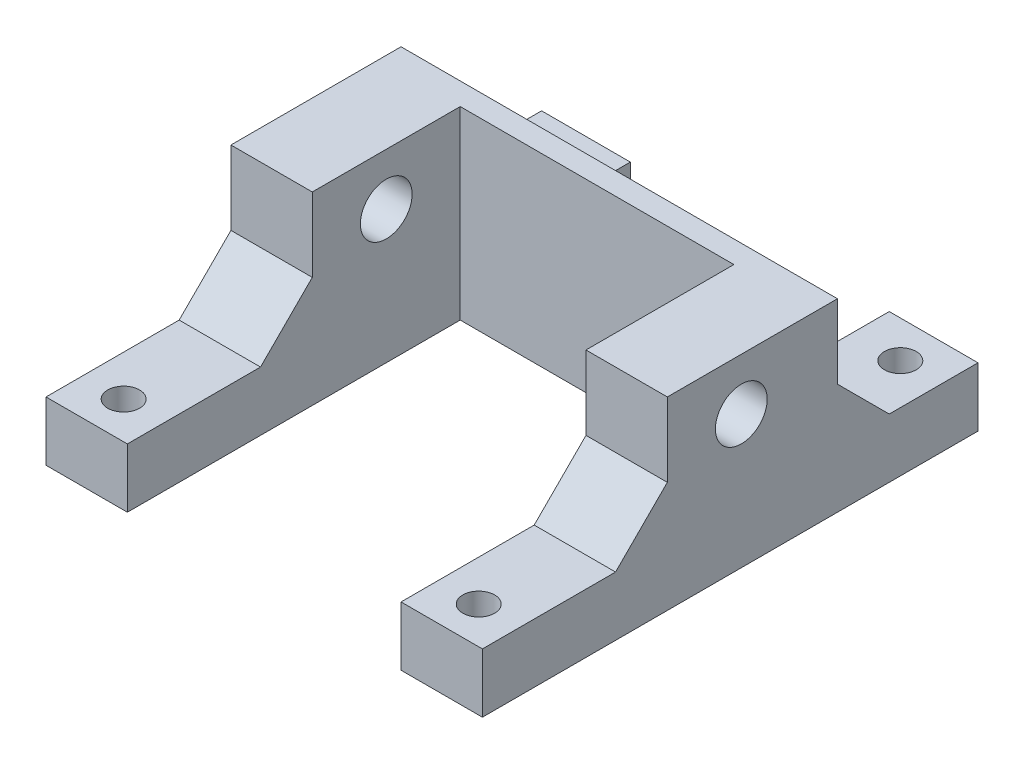
ISO-10303-21;
HEADER;
FILE_DESCRIPTION(('STEP AP214'),'2;1');
FILE_NAME('part.step','',(''),(''),'','','');
FILE_SCHEMA(('AUTOMOTIVE_DESIGN { 1 0 10303 214 1 1 1 1 }'));
ENDSEC;
DATA;
#1=APPLICATION_CONTEXT('core data for automotive mechanical design processes');
#2=APPLICATION_PROTOCOL_DEFINITION('international standard','automotive_design',2000,#1);
#3=PRODUCT_CONTEXT('',#1,'mechanical');
#4=PRODUCT('Part','Part','',(#3));
#5=PRODUCT_RELATED_PRODUCT_CATEGORY('part','',(#4));
#6=PRODUCT_DEFINITION_FORMATION('','',#4);
#7=PRODUCT_DEFINITION_CONTEXT('part definition',#1,'design');
#8=PRODUCT_DEFINITION('design','',#6,#7);
#9=PRODUCT_DEFINITION_SHAPE('','',#8);
#10=(LENGTH_UNIT() NAMED_UNIT(*) SI_UNIT(.MILLI.,.METRE.));
#11=(NAMED_UNIT(*) PLANE_ANGLE_UNIT() SI_UNIT($,.RADIAN.));
#12=(NAMED_UNIT(*) SI_UNIT($,.STERADIAN.) SOLID_ANGLE_UNIT());
#13=UNCERTAINTY_MEASURE_WITH_UNIT(LENGTH_MEASURE(1.E-05),#10,'distance_accuracy_value','');
#14=(GEOMETRIC_REPRESENTATION_CONTEXT(3) GLOBAL_UNCERTAINTY_ASSIGNED_CONTEXT((#13)) GLOBAL_UNIT_ASSIGNED_CONTEXT((#10,
#11,#12)) REPRESENTATION_CONTEXT('',''));
#15=CARTESIAN_POINT('',(0.,0.,0.));
#16=DIRECTION('',(0.,0.,1.));
#17=DIRECTION('',(1.,0.,0.));
#18=AXIS2_PLACEMENT_3D('',#15,#16,#17);
#19=CARTESIAN_POINT('',(29.5,8.00000000000001,0.));
#20=DIRECTION('',(0.,-1.,0.));
#21=DIRECTION('',(0.,0.,1.));
#22=AXIS2_PLACEMENT_3D('',#19,#20,#21);
#23=PLANE('',#22);
#24=CARTESIAN_POINT('',(24.,8.00000000000001,-14.));
#25=DIRECTION('',(0.,1.,0.));
#26=DIRECTION('',(0.,0.,1.));
#27=AXIS2_PLACEMENT_3D('',#24,#25,#26);
#28=CIRCLE('',#27,2.14999999999999);
#29=CARTESIAN_POINT('',(24.,8.00000000000001,-11.85));
#30=VERTEX_POINT('',#29);
#31=EDGE_CURVE('E558',#30,#30,#28,.T.);
#32=ORIENTED_EDGE('',*,*,#31,.F.);
#33=EDGE_LOOP('',(#32));
#34=FACE_BOUND('',#33,.T.);
#35=DIRECTION('',(0.,0.,-1.));
#36=VECTOR('',#35,1.);
#37=CARTESIAN_POINT('',(29.5,8.00000000000001,0.));
#38=LINE('',#37,#36);
#39=CARTESIAN_POINT('',(29.5,8.00000000000001,-7.00000000000012));
#40=VERTEX_POINT('',#39);
#41=CARTESIAN_POINT('',(29.5,8.00000000000001,-19.));
#42=VERTEX_POINT('',#41);
#43=EDGE_CURVE('E315',#40,#42,#38,.T.);
#44=ORIENTED_EDGE('',*,*,#43,.T.);
#45=DIRECTION('',(-1.,0.,0.));
#46=VECTOR('',#45,1.);
#47=CARTESIAN_POINT('',(29.5,8.00000000000001,-19.));
#48=LINE('',#47,#46);
#49=CARTESIAN_POINT('',(17.5,8.00000000000001,-19.));
#50=VERTEX_POINT('',#49);
#51=EDGE_CURVE('E378',#42,#50,#48,.T.);
#52=ORIENTED_EDGE('',*,*,#51,.T.);
#53=DIRECTION('',(0.,0.,1.));
#54=VECTOR('',#53,1.);
#55=CARTESIAN_POINT('',(17.5,8.00000000000001,-5.));
#56=LINE('',#55,#54);
#57=CARTESIAN_POINT('',(17.5,8.00000000000001,-7.00000000000012));
#58=VERTEX_POINT('',#57);
#59=EDGE_CURVE('E234',#50,#58,#56,.T.);
#60=ORIENTED_EDGE('',*,*,#59,.T.);
#61=DIRECTION('',(-1.,0.,0.));
#62=VECTOR('',#61,1.);
#63=CARTESIAN_POINT('',(-29.5,8.00000000000001,-7.00000000000012));
#64=LINE('',#63,#62);
#65=EDGE_CURVE('E409',#40,#58,#64,.T.);
#66=ORIENTED_EDGE('',*,*,#65,.F.);
#67=EDGE_LOOP('',(#44,#52,#60,#66));
#68=FACE_BOUND('',#67,.T.);
#69=ADVANCED_FACE('F47',(#34,#68),#23,.F.);
#70=CARTESIAN_POINT('',(29.5,0.,48.));
#71=DIRECTION('',(0.,1.,0.));
#72=DIRECTION('',(0.,0.,-1.));
#73=AXIS2_PLACEMENT_3D('',#70,#71,#72);
#74=PLANE('',#73);
#75=CARTESIAN_POINT('',(-24.,0.,43.));
#76=DIRECTION('',(0.,1.,0.));
#77=DIRECTION('',(0.,0.,1.));
#78=AXIS2_PLACEMENT_3D('',#75,#76,#77);
#79=CIRCLE('',#78,2.14999999999999);
#80=CARTESIAN_POINT('',(-24.,0.,45.15));
#81=VERTEX_POINT('',#80);
#82=EDGE_CURVE('E544',#81,#81,#79,.T.);
#83=ORIENTED_EDGE('',*,*,#82,.T.);
#84=EDGE_LOOP('',(#83));
#85=FACE_BOUND('',#84,.T.);
#86=CARTESIAN_POINT('',(24.,0.,-14.));
#87=DIRECTION('',(0.,1.,0.));
#88=DIRECTION('',(0.,0.,1.));
#89=AXIS2_PLACEMENT_3D('',#86,#87,#88);
#90=CIRCLE('',#89,2.14999999999999);
#91=CARTESIAN_POINT('',(24.,0.,-11.85));
#92=VERTEX_POINT('',#91);
#93=EDGE_CURVE('E555',#92,#92,#90,.T.);
#94=ORIENTED_EDGE('',*,*,#93,.T.);
#95=EDGE_LOOP('',(#94));
#96=FACE_BOUND('',#95,.T.);
#97=CARTESIAN_POINT('',(24.,0.,43.));
#98=DIRECTION('',(0.,1.,0.));
#99=DIRECTION('',(0.,0.,1.));
#100=AXIS2_PLACEMENT_3D('',#97,#98,#99);
#101=CIRCLE('',#100,2.14999999999999);
#102=CARTESIAN_POINT('',(24.,0.,45.15));
#103=VERTEX_POINT('',#102);
#104=EDGE_CURVE('E562',#103,#103,#101,.T.);
#105=ORIENTED_EDGE('',*,*,#104,.T.);
#106=EDGE_LOOP('',(#105));
#107=FACE_BOUND('',#106,.T.);
#108=DIRECTION('',(-1.,0.,0.));
#109=VECTOR('',#108,1.);
#110=CARTESIAN_POINT('',(29.5,0.,-19.));
#111=LINE('',#110,#109);
#112=CARTESIAN_POINT('',(29.5,0.,-19.));
#113=VERTEX_POINT('',#112);
#114=CARTESIAN_POINT('',(17.5,0.,-19.));
#115=VERTEX_POINT('',#114);
#116=EDGE_CURVE('E375',#113,#115,#111,.T.);
#117=ORIENTED_EDGE('',*,*,#116,.F.);
#118=DIRECTION('',(0.,0.,1.));
#119=VECTOR('',#118,1.);
#120=CARTESIAN_POINT('',(29.5,0.,48.));
#121=LINE('',#120,#119);
#122=CARTESIAN_POINT('',(29.5,0.,48.));
#123=VERTEX_POINT('',#122);
#124=EDGE_CURVE('E321',#113,#123,#121,.T.);
#125=ORIENTED_EDGE('',*,*,#124,.T.);
#126=DIRECTION('',(-1.,0.,0.));
#127=VECTOR('',#126,1.);
#128=CARTESIAN_POINT('',(29.5,0.,48.));
#129=LINE('',#128,#127);
#130=CARTESIAN_POINT('',(18.5,0.,48.));
#131=VERTEX_POINT('',#130);
#132=EDGE_CURVE('E371',#123,#131,#129,.T.);
#133=ORIENTED_EDGE('',*,*,#132,.T.);
#134=DIRECTION('',(0.,0.,-1.));
#135=VECTOR('',#134,1.);
#136=CARTESIAN_POINT('',(18.5,0.,3.));
#137=LINE('',#136,#135);
#138=CARTESIAN_POINT('',(18.5,0.,3.));
#139=VERTEX_POINT('',#138);
#140=EDGE_CURVE('E254',#131,#139,#137,.T.);
#141=ORIENTED_EDGE('',*,*,#140,.T.);
#142=DIRECTION('',(-1.,0.,0.));
#143=VECTOR('',#142,1.);
#144=CARTESIAN_POINT('',(-18.5,0.,3.));
#145=LINE('',#144,#143);
#146=CARTESIAN_POINT('',(-18.5,0.,3.));
#147=VERTEX_POINT('',#146);
#148=EDGE_CURVE('E244',#139,#147,#145,.T.);
#149=ORIENTED_EDGE('',*,*,#148,.T.);
#150=DIRECTION('',(0.,0.,1.));
#151=VECTOR('',#150,1.);
#152=CARTESIAN_POINT('',(-18.5,0.,3.));
#153=LINE('',#152,#151);
#154=CARTESIAN_POINT('',(-18.5,0.,48.));
#155=VERTEX_POINT('',#154);
#156=EDGE_CURVE('E241',#147,#155,#153,.T.);
#157=ORIENTED_EDGE('',*,*,#156,.T.);
#158=CARTESIAN_POINT('',(-29.5,0.,48.));
#159=VERTEX_POINT('',#158);
#160=EDGE_CURVE('E370',#155,#159,#129,.T.);
#161=ORIENTED_EDGE('',*,*,#160,.T.);
#162=DIRECTION('',(0.,0.,1.));
#163=VECTOR('',#162,1.);
#164=CARTESIAN_POINT('',(-29.5,0.,48.));
#165=LINE('',#164,#163);
#166=CARTESIAN_POINT('',(-29.5,0.,-19.));
#167=VERTEX_POINT('',#166);
#168=EDGE_CURVE('E350',#167,#159,#165,.T.);
#169=ORIENTED_EDGE('',*,*,#168,.F.);
#170=CARTESIAN_POINT('',(-17.5,0.,-19.));
#171=VERTEX_POINT('',#170);
#172=EDGE_CURVE('E374',#171,#167,#111,.T.);
#173=ORIENTED_EDGE('',*,*,#172,.F.);
#174=DIRECTION('',(0.,0.,1.));
#175=VECTOR('',#174,1.);
#176=CARTESIAN_POINT('',(-17.5,0.,-5.));
#177=LINE('',#176,#175);
#178=CARTESIAN_POINT('',(-17.5,0.,-5.));
#179=VERTEX_POINT('',#178);
#180=EDGE_CURVE('E235',#171,#179,#177,.T.);
#181=ORIENTED_EDGE('',*,*,#180,.T.);
#182=DIRECTION('',(1.,0.,0.));
#183=VECTOR('',#182,1.);
#184=CARTESIAN_POINT('',(-17.5,0.,-5.));
#185=LINE('',#184,#183);
#186=CARTESIAN_POINT('',(17.5,0.,-5.));
#187=VERTEX_POINT('',#186);
#188=EDGE_CURVE('E219',#179,#187,#185,.T.);
#189=ORIENTED_EDGE('',*,*,#188,.T.);
#190=DIRECTION('',(0.,0.,-1.));
#191=VECTOR('',#190,1.);
#192=CARTESIAN_POINT('',(17.5,0.,-5.));
#193=LINE('',#192,#191);
#194=EDGE_CURVE('E227',#187,#115,#193,.T.);
#195=ORIENTED_EDGE('',*,*,#194,.T.);
#196=EDGE_LOOP('',(#117,#125,#133,#141,#149,#157,#161,#169,#173,#181,#189,#195));
#197=FACE_BOUND('',#196,.T.);
#198=CARTESIAN_POINT('',(-24.,0.,-14.));
#199=DIRECTION('',(0.,1.,0.));
#200=DIRECTION('',(0.,0.,1.));
#201=AXIS2_PLACEMENT_3D('',#198,#199,#200);
#202=CIRCLE('',#201,2.14999999999999);
#203=CARTESIAN_POINT('',(-24.,0.,-11.85));
#204=VERTEX_POINT('',#203);
#205=EDGE_CURVE('E545',#204,#204,#202,.T.);
#206=ORIENTED_EDGE('',*,*,#205,.T.);
#207=EDGE_LOOP('',(#206));
#208=FACE_BOUND('',#207,.T.);
#209=ADVANCED_FACE('F237',(#85,#96,#107,#197,#208),#74,.F.);
#210=CARTESIAN_POINT('',(29.5,8.00000000000001,-19.));
#211=DIRECTION('',(0.,0.,1.));
#212=DIRECTION('',(-1.,0.,0.));
#213=AXIS2_PLACEMENT_3D('',#210,#211,#212);
#214=PLANE('',#213);
#215=ORIENTED_EDGE('',*,*,#51,.F.);
#216=DIRECTION('',(0.,-1.,0.));
#217=VECTOR('',#216,1.);
#218=CARTESIAN_POINT('',(29.5,8.00000000000001,-19.));
#219=LINE('',#218,#217);
#220=EDGE_CURVE('E319',#42,#113,#219,.T.);
#221=ORIENTED_EDGE('',*,*,#220,.T.);
#222=ORIENTED_EDGE('',*,*,#116,.T.);
#223=DIRECTION('',(0.,1.,0.));
#224=VECTOR('',#223,1.);
#225=CARTESIAN_POINT('',(17.5,-0.00100000000001488,-19.));
#226=LINE('',#225,#224);
#227=EDGE_CURVE('E230',#115,#50,#226,.T.);
#228=ORIENTED_EDGE('',*,*,#227,.T.);
#229=EDGE_LOOP('',(#215,#221,#222,#228));
#230=FACE_BOUND('',#229,.T.);
#231=ADVANCED_FACE('F517',(#230),#214,.F.);
#232=CARTESIAN_POINT('',(29.5,8.00000000000001,48.));
#233=DIRECTION('',(0.,0.,-1.));
#234=DIRECTION('',(1.,0.,0.));
#235=AXIS2_PLACEMENT_3D('',#232,#233,#234);
#236=PLANE('',#235);
#237=ORIENTED_EDGE('',*,*,#132,.F.);
#238=DIRECTION('',(0.,1.,0.));
#239=VECTOR('',#238,1.);
#240=CARTESIAN_POINT('',(29.5,8.00000000000001,48.));
#241=LINE('',#240,#239);
#242=CARTESIAN_POINT('',(29.5,8.00000000000001,48.));
#243=VERTEX_POINT('',#242);
#244=EDGE_CURVE('E325',#123,#243,#241,.T.);
#245=ORIENTED_EDGE('',*,*,#244,.T.);
#246=DIRECTION('',(-1.,0.,0.));
#247=VECTOR('',#246,1.);
#248=CARTESIAN_POINT('',(29.5,8.00000000000001,48.));
#249=LINE('',#248,#247);
#250=CARTESIAN_POINT('',(18.5,8.00000000000001,48.));
#251=VERTEX_POINT('',#250);
#252=EDGE_CURVE('E367',#243,#251,#249,.T.);
#253=ORIENTED_EDGE('',*,*,#252,.T.);
#254=DIRECTION('',(0.,1.,0.));
#255=VECTOR('',#254,1.);
#256=CARTESIAN_POINT('',(18.5,-0.00100000000000794,48.));
#257=LINE('',#256,#255);
#258=EDGE_CURVE('E264',#131,#251,#257,.T.);
#259=ORIENTED_EDGE('',*,*,#258,.F.);
#260=EDGE_LOOP('',(#237,#245,#253,#259));
#261=FACE_BOUND('',#260,.T.);
#262=ADVANCED_FACE('F514',(#261),#236,.F.);
#263=CARTESIAN_POINT('',(29.5,8.00000000000001,23.));
#264=DIRECTION('',(0.,-1.,0.));
#265=DIRECTION('',(0.,0.,1.));
#266=AXIS2_PLACEMENT_3D('',#263,#264,#265);
#267=PLANE('',#266);
#268=CARTESIAN_POINT('',(24.,8.00000000000001,43.));
#269=DIRECTION('',(0.,1.,0.));
#270=DIRECTION('',(0.,0.,1.));
#271=AXIS2_PLACEMENT_3D('',#268,#269,#270);
#272=CIRCLE('',#271,2.14999999999999);
#273=CARTESIAN_POINT('',(24.,8.00000000000001,45.15));
#274=VERTEX_POINT('',#273);
#275=EDGE_CURVE('E566',#274,#274,#272,.T.);
#276=ORIENTED_EDGE('',*,*,#275,.F.);
#277=EDGE_LOOP('',(#276));
#278=FACE_BOUND('',#277,.T.);
#279=DIRECTION('',(0.,0.,1.));
#280=VECTOR('',#279,1.);
#281=CARTESIAN_POINT('',(18.5,8.00000000000001,3.));
#282=LINE('',#281,#280);
#283=CARTESIAN_POINT('',(18.5,8.00000000000001,30.));
#284=VERTEX_POINT('',#283);
#285=EDGE_CURVE('E258',#284,#251,#282,.T.);
#286=ORIENTED_EDGE('',*,*,#285,.T.);
#287=ORIENTED_EDGE('',*,*,#252,.F.);
#288=DIRECTION('',(0.,0.,-1.));
#289=VECTOR('',#288,1.);
#290=CARTESIAN_POINT('',(29.5,8.00000000000001,23.));
#291=LINE('',#290,#289);
#292=CARTESIAN_POINT('',(29.5,8.00000000000001,30.));
#293=VERTEX_POINT('',#292);
#294=EDGE_CURVE('E328',#243,#293,#291,.T.);
#295=ORIENTED_EDGE('',*,*,#294,.T.);
#296=DIRECTION('',(1.,0.,0.));
#297=VECTOR('',#296,1.);
#298=CARTESIAN_POINT('',(29.5,8.00000000000001,30.));
#299=LINE('',#298,#297);
#300=EDGE_CURVE('E395',#284,#293,#299,.T.);
#301=ORIENTED_EDGE('',*,*,#300,.F.);
#302=EDGE_LOOP('',(#286,#287,#295,#301));
#303=FACE_BOUND('',#302,.T.);
#304=ADVANCED_FACE('F510',(#278,#303),#267,.F.);
#305=CARTESIAN_POINT('',(29.5,25.,23.));
#306=DIRECTION('',(0.,0.,-1.));
#307=DIRECTION('',(1.,0.,0.));
#308=AXIS2_PLACEMENT_3D('',#305,#306,#307);
#309=PLANE('',#308);
#310=DIRECTION('',(0.,1.,0.));
#311=VECTOR('',#310,1.);
#312=CARTESIAN_POINT('',(-18.5,8.00000000000001,23.));
#313=LINE('',#312,#311);
#314=CARTESIAN_POINT('',(-18.5,15.,23.));
#315=VERTEX_POINT('',#314);
#316=CARTESIAN_POINT('',(-18.5,25.,23.));
#317=VERTEX_POINT('',#316);
#318=EDGE_CURVE('E268',#315,#317,#313,.T.);
#319=ORIENTED_EDGE('',*,*,#318,.T.);
#320=DIRECTION('',(-1.,0.,0.));
#321=VECTOR('',#320,1.);
#322=CARTESIAN_POINT('',(29.5,25.,23.));
#323=LINE('',#322,#321);
#324=CARTESIAN_POINT('',(-29.5,25.,23.));
#325=VERTEX_POINT('',#324);
#326=EDGE_CURVE('E336',#317,#325,#323,.T.);
#327=ORIENTED_EDGE('',*,*,#326,.T.);
#328=DIRECTION('',(0.,1.,0.));
#329=VECTOR('',#328,1.);
#330=CARTESIAN_POINT('',(-29.5,25.,23.));
#331=LINE('',#330,#329);
#332=CARTESIAN_POINT('',(-29.5,15.,23.));
#333=VERTEX_POINT('',#332);
#334=EDGE_CURVE('E311',#333,#325,#331,.T.);
#335=ORIENTED_EDGE('',*,*,#334,.F.);
#336=DIRECTION('',(-1.,0.,0.));
#337=VECTOR('',#336,1.);
#338=CARTESIAN_POINT('',(-29.5,15.,23.));
#339=LINE('',#338,#337);
#340=EDGE_CURVE('E399',#315,#333,#339,.T.);
#341=ORIENTED_EDGE('',*,*,#340,.F.);
#342=EDGE_LOOP('',(#319,#327,#335,#341));
#343=FACE_BOUND('',#342,.T.);
#344=ADVANCED_FACE('F494',(#343),#309,.F.);
#345=CARTESIAN_POINT('',(29.5,18.,13.));
#346=DIRECTION('',(-1.,0.,0.));
#347=DIRECTION('',(0.,0.,-1.));
#348=AXIS2_PLACEMENT_3D('',#345,#346,#347);
#349=CYLINDRICAL_SURFACE('',#348,3.5);
#350=CARTESIAN_POINT('',(-18.5,18.,13.));
#351=DIRECTION('',(1.,0.,0.));
#352=DIRECTION('',(0.,0.,-1.));
#353=AXIS2_PLACEMENT_3D('',#350,#351,#352);
#354=CIRCLE('',#353,3.5);
#355=CARTESIAN_POINT('',(-18.5,18.,9.5));
#356=VERTEX_POINT('',#355);
#357=EDGE_CURVE('E305',#356,#356,#354,.T.);
#358=ORIENTED_EDGE('',*,*,#357,.T.);
#359=EDGE_LOOP('',(#358));
#360=FACE_BOUND('',#359,.T.);
#361=CARTESIAN_POINT('',(-29.5,18.,13.));
#362=DIRECTION('',(-1.,0.,0.));
#363=DIRECTION('',(0.,0.,1.));
#364=AXIS2_PLACEMENT_3D('',#361,#362,#363);
#365=CIRCLE('',#364,3.5);
#366=CARTESIAN_POINT('',(-29.5,18.,16.5));
#367=VERTEX_POINT('',#366);
#368=EDGE_CURVE('E301',#367,#367,#365,.T.);
#369=ORIENTED_EDGE('',*,*,#368,.T.);
#370=EDGE_LOOP('',(#369));
#371=FACE_BOUND('',#370,.T.);
#372=ADVANCED_FACE('F579',(#360,#371),#349,.F.);
#373=CARTESIAN_POINT('',(29.5,0.,0.));
#374=DIRECTION('',(-1.,0.,0.));
#375=DIRECTION('',(0.,0.,-1.));
#376=AXIS2_PLACEMENT_3D('',#373,#374,#375);
#377=PLANE('',#376);
#378=DIRECTION('',(0.,0.,-1.));
#379=VECTOR('',#378,1.);
#380=CARTESIAN_POINT('',(29.5,25.,0.));
#381=LINE('',#380,#379);
#382=CARTESIAN_POINT('',(29.5,25.,23.));
#383=VERTEX_POINT('',#382);
#384=CARTESIAN_POINT('',(29.5,25.,0.));
#385=VERTEX_POINT('',#384);
#386=EDGE_CURVE('E306',#383,#385,#381,.T.);
#387=ORIENTED_EDGE('',*,*,#386,.F.);
#388=DIRECTION('',(0.,1.,0.));
#389=VECTOR('',#388,1.);
#390=CARTESIAN_POINT('',(29.5,25.,23.));
#391=LINE('',#390,#389);
#392=CARTESIAN_POINT('',(29.5,15.,23.));
#393=VERTEX_POINT('',#392);
#394=EDGE_CURVE('E332',#393,#383,#391,.T.);
#395=ORIENTED_EDGE('',*,*,#394,.F.);
#396=DIRECTION('',(0.,-0.707106781186551,0.707106781186544));
#397=VECTOR('',#396,1.);
#398=CARTESIAN_POINT('',(29.5,18.9999999999999,19.0000000000001));
#399=LINE('',#398,#397);
#400=EDGE_CURVE('E419',#293,#393,#399,.F.);
#401=ORIENTED_EDGE('',*,*,#400,.F.);
#402=ORIENTED_EDGE('',*,*,#294,.F.);
#403=ORIENTED_EDGE('',*,*,#244,.F.);
#404=ORIENTED_EDGE('',*,*,#124,.F.);
#405=ORIENTED_EDGE('',*,*,#220,.F.);
#406=ORIENTED_EDGE('',*,*,#43,.F.);
#407=DIRECTION('',(0.,0.707106781186544,0.707106781186551));
#408=VECTOR('',#407,1.);
#409=CARTESIAN_POINT('',(29.5,7.50000000000011,-7.50000000000003));
#410=LINE('',#409,#408);
#411=CARTESIAN_POINT('',(29.5,15.0000000000001,0.));
#412=VERTEX_POINT('',#411);
#413=EDGE_CURVE('E12',#412,#40,#410,.F.);
#414=ORIENTED_EDGE('',*,*,#413,.F.);
#415=DIRECTION('',(0.,-1.,0.));
#416=VECTOR('',#415,1.);
#417=CARTESIAN_POINT('',(29.5,8.00000000000001,0.));
#418=LINE('',#417,#416);
#419=EDGE_CURVE('E310',#385,#412,#418,.T.);
#420=ORIENTED_EDGE('',*,*,#419,.F.);
#421=EDGE_LOOP('',(#387,#395,#401,#402,#403,#404,#405,#406,#414,#420));
#422=FACE_BOUND('',#421,.T.);
#423=CARTESIAN_POINT('',(29.5,18.,13.));
#424=DIRECTION('',(-1.,0.,0.));
#425=DIRECTION('',(0.,0.,1.));
#426=AXIS2_PLACEMENT_3D('',#423,#424,#425);
#427=CIRCLE('',#426,3.5);
#428=CARTESIAN_POINT('',(29.5,18.,16.5));
#429=VERTEX_POINT('',#428);
#430=EDGE_CURVE('E296',#429,#429,#427,.T.);
#431=ORIENTED_EDGE('',*,*,#430,.T.);
#432=EDGE_LOOP('',(#431));
#433=FACE_BOUND('',#432,.T.);
#434=ADVANCED_FACE('F452',(#422,#433),#377,.F.);
#435=CARTESIAN_POINT('',(-29.5,0.,0.));
#436=DIRECTION('',(-1.,0.,0.));
#437=DIRECTION('',(0.,0.,-1.));
#438=AXIS2_PLACEMENT_3D('',#435,#436,#437);
#439=PLANE('',#438);
#440=DIRECTION('',(0.,0.,-1.));
#441=VECTOR('',#440,1.);
#442=CARTESIAN_POINT('',(-29.5,25.,0.));
#443=LINE('',#442,#441);
#444=CARTESIAN_POINT('',(-29.5,25.,0.));
#445=VERTEX_POINT('',#444);
#446=EDGE_CURVE('E300',#325,#445,#443,.T.);
#447=ORIENTED_EDGE('',*,*,#446,.T.);
#448=DIRECTION('',(0.,-1.,0.));
#449=VECTOR('',#448,1.);
#450=CARTESIAN_POINT('',(-29.5,8.00000000000001,0.));
#451=LINE('',#450,#449);
#452=CARTESIAN_POINT('',(-29.5,15.0000000000001,0.));
#453=VERTEX_POINT('',#452);
#454=EDGE_CURVE('E340',#445,#453,#451,.T.);
#455=ORIENTED_EDGE('',*,*,#454,.T.);
#456=DIRECTION('',(0.,-0.707106781186544,-0.707106781186551));
#457=VECTOR('',#456,1.);
#458=CARTESIAN_POINT('',(-29.5,8.00000000000001,-7.00000000000012));
#459=LINE('',#458,#457);
#460=CARTESIAN_POINT('',(-29.5,8.00000000000001,-7.00000000000012));
#461=VERTEX_POINT('',#460);
#462=EDGE_CURVE('E56',#461,#453,#459,.F.);
#463=ORIENTED_EDGE('',*,*,#462,.F.);
#464=DIRECTION('',(0.,0.,-1.));
#465=VECTOR('',#464,1.);
#466=CARTESIAN_POINT('',(-29.5,8.00000000000001,0.));
#467=LINE('',#466,#465);
#468=CARTESIAN_POINT('',(-29.5,8.00000000000001,-19.));
#469=VERTEX_POINT('',#468);
#470=EDGE_CURVE('E344',#461,#469,#467,.T.);
#471=ORIENTED_EDGE('',*,*,#470,.T.);
#472=DIRECTION('',(0.,-1.,0.));
#473=VECTOR('',#472,1.);
#474=CARTESIAN_POINT('',(-29.5,8.00000000000001,-19.));
#475=LINE('',#474,#473);
#476=EDGE_CURVE('E348',#469,#167,#475,.T.);
#477=ORIENTED_EDGE('',*,*,#476,.T.);
#478=ORIENTED_EDGE('',*,*,#168,.T.);
#479=DIRECTION('',(0.,1.,0.));
#480=VECTOR('',#479,1.);
#481=CARTESIAN_POINT('',(-29.5,8.00000000000001,48.));
#482=LINE('',#481,#480);
#483=CARTESIAN_POINT('',(-29.5,8.00000000000001,48.));
#484=VERTEX_POINT('',#483);
#485=EDGE_CURVE('E353',#159,#484,#482,.T.);
#486=ORIENTED_EDGE('',*,*,#485,.T.);
#487=DIRECTION('',(0.,0.,-1.));
#488=VECTOR('',#487,1.);
#489=CARTESIAN_POINT('',(-29.5,8.00000000000001,23.));
#490=LINE('',#489,#488);
#491=CARTESIAN_POINT('',(-29.5,8.00000000000001,30.));
#492=VERTEX_POINT('',#491);
#493=EDGE_CURVE('E356',#484,#492,#490,.T.);
#494=ORIENTED_EDGE('',*,*,#493,.T.);
#495=DIRECTION('',(0.,0.707106781186551,-0.707106781186544));
#496=VECTOR('',#495,1.);
#497=CARTESIAN_POINT('',(-29.5,15.,23.));
#498=LINE('',#497,#496);
#499=EDGE_CURVE('E423',#333,#492,#498,.F.);
#500=ORIENTED_EDGE('',*,*,#499,.F.);
#501=ORIENTED_EDGE('',*,*,#334,.T.);
#502=EDGE_LOOP('',(#447,#455,#463,#471,#477,#478,#486,#494,#500,#501));
#503=FACE_BOUND('',#502,.T.);
#504=ORIENTED_EDGE('',*,*,#368,.F.);
#505=EDGE_LOOP('',(#504));
#506=FACE_BOUND('',#505,.T.);
#507=ADVANCED_FACE('F443',(#503,#506),#439,.T.);
#508=CARTESIAN_POINT('',(29.5,25.,0.));
#509=DIRECTION('',(0.,-1.,0.));
#510=DIRECTION('',(0.,0.,1.));
#511=AXIS2_PLACEMENT_3D('',#508,#509,#510);
#512=PLANE('',#511);
#513=DIRECTION('',(-1.,0.,0.));
#514=VECTOR('',#513,1.);
#515=CARTESIAN_POINT('',(18.5,25.,3.));
#516=LINE('',#515,#514);
#517=CARTESIAN_POINT('',(18.5,25.,3.));
#518=VERTEX_POINT('',#517);
#519=CARTESIAN_POINT('',(-18.5,25.,3.));
#520=VERTEX_POINT('',#519);
#521=EDGE_CURVE('E278',#518,#520,#516,.T.);
#522=ORIENTED_EDGE('',*,*,#521,.F.);
#523=DIRECTION('',(0.,0.,1.));
#524=VECTOR('',#523,1.);
#525=CARTESIAN_POINT('',(18.5,25.,-40.7185461430047));
#526=LINE('',#525,#524);
#527=CARTESIAN_POINT('',(18.5,25.,23.));
#528=VERTEX_POINT('',#527);
#529=EDGE_CURVE('E275',#518,#528,#526,.T.);
#530=ORIENTED_EDGE('',*,*,#529,.T.);
#531=EDGE_CURVE('E362',#383,#528,#323,.T.);
#532=ORIENTED_EDGE('',*,*,#531,.F.);
#533=ORIENTED_EDGE('',*,*,#386,.T.);
#534=DIRECTION('',(-1.,0.,0.));
#535=VECTOR('',#534,1.);
#536=CARTESIAN_POINT('',(29.5,25.,0.));
#537=LINE('',#536,#535);
#538=EDGE_CURVE('E382',#385,#445,#537,.T.);
#539=ORIENTED_EDGE('',*,*,#538,.T.);
#540=ORIENTED_EDGE('',*,*,#446,.F.);
#541=ORIENTED_EDGE('',*,*,#326,.F.);
#542=DIRECTION('',(0.,0.,1.));
#543=VECTOR('',#542,1.);
#544=CARTESIAN_POINT('',(-18.5,25.,-40.7185461430047));
#545=LINE('',#544,#543);
#546=EDGE_CURVE('E286',#520,#317,#545,.T.);
#547=ORIENTED_EDGE('',*,*,#546,.F.);
#548=EDGE_LOOP('',(#522,#530,#532,#533,#539,#540,#541,#547));
#549=FACE_BOUND('',#548,.T.);
#550=ADVANCED_FACE('F500',(#549),#512,.F.);
#551=CARTESIAN_POINT('',(29.5,8.00000000000001,0.));
#552=DIRECTION('',(0.,0.,1.));
#553=DIRECTION('',(-1.,0.,0.));
#554=AXIS2_PLACEMENT_3D('',#551,#552,#553);
#555=PLANE('',#554);
#556=ORIENTED_EDGE('',*,*,#454,.F.);
#557=ORIENTED_EDGE('',*,*,#538,.F.);
#558=ORIENTED_EDGE('',*,*,#419,.T.);
#559=DIRECTION('',(1.,0.,0.));
#560=VECTOR('',#559,1.);
#561=CARTESIAN_POINT('',(29.5,15.0000000000001,0.));
#562=LINE('',#561,#560);
#563=EDGE_CURVE('E413',#453,#412,#562,.T.);
#564=ORIENTED_EDGE('',*,*,#563,.F.);
#565=EDGE_LOOP('',(#556,#557,#558,#564));
#566=FACE_BOUND('',#565,.T.);
#567=ADVANCED_FACE('F446',(#566),#555,.F.);
#568=CARTESIAN_POINT('',(-24.,8.00000000000001,-14.));
#569=DIRECTION('',(0.,1.,0.));
#570=DIRECTION('',(0.,0.,1.));
#571=AXIS2_PLACEMENT_3D('',#568,#569,#570);
#572=CIRCLE('',#571,2.14999999999999);
#573=CARTESIAN_POINT('',(-24.,8.00000000000001,-11.85));
#574=VERTEX_POINT('',#573);
#575=EDGE_CURVE('E542',#574,#574,#572,.T.);
#576=ORIENTED_EDGE('',*,*,#575,.F.);
#577=EDGE_LOOP('',(#576));
#578=FACE_BOUND('',#577,.T.);
#579=DIRECTION('',(0.,0.,-1.));
#580=VECTOR('',#579,1.);
#581=CARTESIAN_POINT('',(-17.5,8.00000000000001,-5.));
#582=LINE('',#581,#580);
#583=CARTESIAN_POINT('',(-17.5,8.00000000000001,-7.00000000000012));
#584=VERTEX_POINT('',#583);
#585=CARTESIAN_POINT('',(-17.5,8.00000000000001,-19.));
#586=VERTEX_POINT('',#585);
#587=EDGE_CURVE('E224',#584,#586,#582,.T.);
#588=ORIENTED_EDGE('',*,*,#587,.T.);
#589=EDGE_CURVE('E377',#586,#469,#48,.T.);
#590=ORIENTED_EDGE('',*,*,#589,.T.);
#591=ORIENTED_EDGE('',*,*,#470,.F.);
#592=DIRECTION('',(-1.,0.,0.));
#593=VECTOR('',#592,1.);
#594=CARTESIAN_POINT('',(-29.5,8.00000000000001,-7.00000000000012));
#595=LINE('',#594,#593);
#596=EDGE_CURVE('E406',#584,#461,#595,.T.);
#597=ORIENTED_EDGE('',*,*,#596,.F.);
#598=EDGE_LOOP('',(#588,#590,#591,#597));
#599=FACE_BOUND('',#598,.T.);
#600=ADVANCED_FACE('F471',(#578,#599),#23,.F.);
#601=ORIENTED_EDGE('',*,*,#172,.T.);
#602=ORIENTED_EDGE('',*,*,#476,.F.);
#603=ORIENTED_EDGE('',*,*,#589,.F.);
#604=DIRECTION('',(0.,1.,0.));
#605=VECTOR('',#604,1.);
#606=CARTESIAN_POINT('',(-17.5,-0.00100000000001488,-19.));
#607=LINE('',#606,#605);
#608=EDGE_CURVE('E247',#171,#586,#607,.T.);
#609=ORIENTED_EDGE('',*,*,#608,.F.);
#610=EDGE_LOOP('',(#601,#602,#603,#609));
#611=FACE_BOUND('',#610,.T.);
#612=ADVANCED_FACE('F478',(#611),#214,.F.);
#613=CARTESIAN_POINT('',(-18.5,8.00000000000001,48.));
#614=VERTEX_POINT('',#613);
#615=EDGE_CURVE('E366',#614,#484,#249,.T.);
#616=ORIENTED_EDGE('',*,*,#615,.T.);
#617=ORIENTED_EDGE('',*,*,#485,.F.);
#618=ORIENTED_EDGE('',*,*,#160,.F.);
#619=DIRECTION('',(0.,1.,0.));
#620=VECTOR('',#619,1.);
#621=CARTESIAN_POINT('',(-18.5,-0.00100000000000794,48.));
#622=LINE('',#621,#620);
#623=EDGE_CURVE('E265',#155,#614,#622,.T.);
#624=ORIENTED_EDGE('',*,*,#623,.T.);
#625=EDGE_LOOP('',(#616,#617,#618,#624));
#626=FACE_BOUND('',#625,.T.);
#627=ADVANCED_FACE('F482',(#626),#236,.F.);
#628=CARTESIAN_POINT('',(-24.,8.00000000000001,43.));
#629=DIRECTION('',(0.,1.,0.));
#630=DIRECTION('',(0.,0.,1.));
#631=AXIS2_PLACEMENT_3D('',#628,#629,#630);
#632=CIRCLE('',#631,2.14999999999999);
#633=CARTESIAN_POINT('',(-24.,8.00000000000001,45.15));
#634=VERTEX_POINT('',#633);
#635=EDGE_CURVE('E548',#634,#634,#632,.T.);
#636=ORIENTED_EDGE('',*,*,#635,.F.);
#637=EDGE_LOOP('',(#636));
#638=FACE_BOUND('',#637,.T.);
#639=ORIENTED_EDGE('',*,*,#493,.F.);
#640=ORIENTED_EDGE('',*,*,#615,.F.);
#641=DIRECTION('',(0.,0.,-1.));
#642=VECTOR('',#641,1.);
#643=CARTESIAN_POINT('',(-18.5,8.00000000000001,3.));
#644=LINE('',#643,#642);
#645=CARTESIAN_POINT('',(-18.5,8.00000000000001,30.));
#646=VERTEX_POINT('',#645);
#647=EDGE_CURVE('E261',#614,#646,#644,.T.);
#648=ORIENTED_EDGE('',*,*,#647,.T.);
#649=DIRECTION('',(1.,0.,0.));
#650=VECTOR('',#649,1.);
#651=CARTESIAN_POINT('',(-18.5,8.00000000000001,30.));
#652=LINE('',#651,#650);
#653=EDGE_CURVE('E403',#492,#646,#652,.T.);
#654=ORIENTED_EDGE('',*,*,#653,.F.);
#655=EDGE_LOOP('',(#639,#640,#648,#654));
#656=FACE_BOUND('',#655,.T.);
#657=ADVANCED_FACE('F486',(#638,#656),#267,.F.);
#658=ORIENTED_EDGE('',*,*,#394,.T.);
#659=ORIENTED_EDGE('',*,*,#531,.T.);
#660=DIRECTION('',(0.,-1.,0.));
#661=VECTOR('',#660,1.);
#662=CARTESIAN_POINT('',(18.5,8.00000000000001,23.));
#663=LINE('',#662,#661);
#664=CARTESIAN_POINT('',(18.5,15.,23.));
#665=VERTEX_POINT('',#664);
#666=EDGE_CURVE('E282',#528,#665,#663,.T.);
#667=ORIENTED_EDGE('',*,*,#666,.T.);
#668=DIRECTION('',(-1.,0.,0.));
#669=VECTOR('',#668,1.);
#670=CARTESIAN_POINT('',(18.5,15.,23.));
#671=LINE('',#670,#669);
#672=EDGE_CURVE('E385',#393,#665,#671,.T.);
#673=ORIENTED_EDGE('',*,*,#672,.F.);
#674=EDGE_LOOP('',(#658,#659,#667,#673));
#675=FACE_BOUND('',#674,.T.);
#676=ADVANCED_FACE('F503',(#675),#309,.F.);
#677=CARTESIAN_POINT('',(18.5,18.,13.));
#678=DIRECTION('',(-1.,0.,0.));
#679=DIRECTION('',(0.,0.,1.));
#680=AXIS2_PLACEMENT_3D('',#677,#678,#679);
#681=CIRCLE('',#680,3.5);
#682=CARTESIAN_POINT('',(18.5,18.,16.5));
#683=VERTEX_POINT('',#682);
#684=EDGE_CURVE('E295',#683,#683,#681,.T.);
#685=ORIENTED_EDGE('',*,*,#684,.T.);
#686=EDGE_LOOP('',(#685));
#687=FACE_BOUND('',#686,.T.);
#688=ORIENTED_EDGE('',*,*,#430,.F.);
#689=EDGE_LOOP('',(#688));
#690=FACE_BOUND('',#689,.T.);
#691=ADVANCED_FACE('F587',(#687,#690),#349,.F.);
#692=CARTESIAN_POINT('',(-18.5,7.99999999999998,-40.7185461430047));
#693=DIRECTION('',(-1.,0.,0.));
#694=DIRECTION('',(0.,0.,-1.));
#695=AXIS2_PLACEMENT_3D('',#692,#693,#694);
#696=PLANE('',#695);
#697=ORIENTED_EDGE('',*,*,#357,.F.);
#698=EDGE_LOOP('',(#697));
#699=FACE_BOUND('',#698,.T.);
#700=DIRECTION('',(0.,-1.,0.));
#701=VECTOR('',#700,1.);
#702=CARTESIAN_POINT('',(-18.5,7.99999999999998,3.));
#703=LINE('',#702,#701);
#704=EDGE_CURVE('E274',#520,#147,#703,.T.);
#705=ORIENTED_EDGE('',*,*,#704,.F.);
#706=ORIENTED_EDGE('',*,*,#546,.T.);
#707=ORIENTED_EDGE('',*,*,#318,.F.);
#708=DIRECTION('',(0.,-0.707106781186551,0.707106781186544));
#709=VECTOR('',#708,1.);
#710=CARTESIAN_POINT('',(-18.5,43.3592730715023,-5.35927307150198));
#711=LINE('',#710,#709);
#712=EDGE_CURVE('E426',#646,#315,#711,.F.);
#713=ORIENTED_EDGE('',*,*,#712,.F.);
#714=ORIENTED_EDGE('',*,*,#647,.F.);
#715=ORIENTED_EDGE('',*,*,#623,.F.);
#716=ORIENTED_EDGE('',*,*,#156,.F.);
#717=EDGE_LOOP('',(#705,#706,#707,#713,#714,#715,#716));
#718=FACE_BOUND('',#717,.T.);
#719=ADVANCED_FACE('F622',(#699,#718),#696,.F.);
#720=CARTESIAN_POINT('',(18.5,7.99999999999998,-40.7185461430047));
#721=DIRECTION('',(1.,0.,0.));
#722=DIRECTION('',(0.,0.,1.));
#723=AXIS2_PLACEMENT_3D('',#720,#721,#722);
#724=PLANE('',#723);
#725=ORIENTED_EDGE('',*,*,#684,.F.);
#726=EDGE_LOOP('',(#725));
#727=FACE_BOUND('',#726,.T.);
#728=DIRECTION('',(0.,1.,0.));
#729=VECTOR('',#728,1.);
#730=CARTESIAN_POINT('',(18.5,7.99999999999998,3.));
#731=LINE('',#730,#729);
#732=EDGE_CURVE('E271',#139,#518,#731,.T.);
#733=ORIENTED_EDGE('',*,*,#732,.F.);
#734=ORIENTED_EDGE('',*,*,#140,.F.);
#735=ORIENTED_EDGE('',*,*,#258,.T.);
#736=ORIENTED_EDGE('',*,*,#285,.F.);
#737=DIRECTION('',(0.,0.707106781186551,-0.707106781186544));
#738=VECTOR('',#737,1.);
#739=CARTESIAN_POINT('',(18.5,43.3592730715023,-5.35927307150198));
#740=LINE('',#739,#738);
#741=EDGE_CURVE('E416',#665,#284,#740,.F.);
#742=ORIENTED_EDGE('',*,*,#741,.F.);
#743=ORIENTED_EDGE('',*,*,#666,.F.);
#744=ORIENTED_EDGE('',*,*,#529,.F.);
#745=EDGE_LOOP('',(#733,#734,#735,#736,#742,#743,#744));
#746=FACE_BOUND('',#745,.T.);
#747=ADVANCED_FACE('F618',(#727,#746),#724,.F.);
#748=CARTESIAN_POINT('',(29.5,8.00000000000001,3.));
#749=DIRECTION('',(0.,0.,1.));
#750=DIRECTION('',(-1.,0.,0.));
#751=AXIS2_PLACEMENT_3D('',#748,#749,#750);
#752=PLANE('',#751);
#753=ORIENTED_EDGE('',*,*,#704,.T.);
#754=ORIENTED_EDGE('',*,*,#148,.F.);
#755=ORIENTED_EDGE('',*,*,#732,.T.);
#756=ORIENTED_EDGE('',*,*,#521,.T.);
#757=EDGE_LOOP('',(#753,#754,#755,#756));
#758=FACE_BOUND('',#757,.T.);
#759=ADVANCED_FACE('F615',(#758),#752,.T.);
#760=CARTESIAN_POINT('',(17.5,-0.00100000000001314,-5.));
#761=DIRECTION('',(1.,0.,0.));
#762=DIRECTION('',(0.,0.,1.));
#763=AXIS2_PLACEMENT_3D('',#760,#761,#762);
#764=PLANE('',#763);
#765=ORIENTED_EDGE('',*,*,#194,.F.);
#766=DIRECTION('',(0.,1.,0.));
#767=VECTOR('',#766,1.);
#768=CARTESIAN_POINT('',(17.5,-0.00100000000001314,-5.));
#769=LINE('',#768,#767);
#770=CARTESIAN_POINT('',(17.5,10.0000000000001,-5.));
#771=VERTEX_POINT('',#770);
#772=EDGE_CURVE('E215',#187,#771,#769,.T.);
#773=ORIENTED_EDGE('',*,*,#772,.T.);
#774=DIRECTION('',(0.,-0.707106781186544,-0.707106781186551));
#775=VECTOR('',#774,1.);
#776=CARTESIAN_POINT('',(17.5,4.9995000000001,-10.0005000000001));
#777=LINE('',#776,#775);
#778=EDGE_CURVE('E429',#58,#771,#777,.F.);
#779=ORIENTED_EDGE('',*,*,#778,.F.);
#780=ORIENTED_EDGE('',*,*,#59,.F.);
#781=ORIENTED_EDGE('',*,*,#227,.F.);
#782=EDGE_LOOP('',(#765,#773,#779,#780,#781));
#783=FACE_BOUND('',#782,.T.);
#784=ADVANCED_FACE('F228',(#783),#764,.F.);
#785=CARTESIAN_POINT('',(-17.5,-0.00100000000001314,-5.));
#786=DIRECTION('',(-1.,0.,0.));
#787=DIRECTION('',(0.,0.,-1.));
#788=AXIS2_PLACEMENT_3D('',#785,#786,#787);
#789=PLANE('',#788);
#790=ORIENTED_EDGE('',*,*,#180,.F.);
#791=ORIENTED_EDGE('',*,*,#608,.T.);
#792=ORIENTED_EDGE('',*,*,#587,.F.);
#793=DIRECTION('',(0.,0.707106781186544,0.707106781186551));
#794=VECTOR('',#793,1.);
#795=CARTESIAN_POINT('',(-17.5,4.9995000000001,-10.0005000000001));
#796=LINE('',#795,#794);
#797=CARTESIAN_POINT('',(-17.5,10.0000000000001,-5.));
#798=VERTEX_POINT('',#797);
#799=EDGE_CURVE('E434',#798,#584,#796,.F.);
#800=ORIENTED_EDGE('',*,*,#799,.F.);
#801=DIRECTION('',(0.,1.,0.));
#802=VECTOR('',#801,1.);
#803=CARTESIAN_POINT('',(-17.5,-0.00100000000001314,-5.));
#804=LINE('',#803,#802);
#805=EDGE_CURVE('E223',#179,#798,#804,.T.);
#806=ORIENTED_EDGE('',*,*,#805,.F.);
#807=EDGE_LOOP('',(#790,#791,#792,#800,#806));
#808=FACE_BOUND('',#807,.T.);
#809=ADVANCED_FACE('F469',(#808),#789,.F.);
#810=CARTESIAN_POINT('',(-17.5,-0.00100000000001314,-5.));
#811=DIRECTION('',(0.,0.,1.));
#812=DIRECTION('',(0.,1.,0.));
#813=AXIS2_PLACEMENT_3D('',#810,#811,#812);
#814=PLANE('',#813);
#815=ORIENTED_EDGE('',*,*,#188,.F.);
#816=ORIENTED_EDGE('',*,*,#805,.T.);
#817=DIRECTION('',(1.,0.,0.));
#818=VECTOR('',#817,1.);
#819=CARTESIAN_POINT('',(-17.5,10.0000000000001,-5.));
#820=LINE('',#819,#818);
#821=EDGE_CURVE('E66',#771,#798,#820,.F.);
#822=ORIENTED_EDGE('',*,*,#821,.F.);
#823=ORIENTED_EDGE('',*,*,#772,.F.);
#824=EDGE_LOOP('',(#815,#816,#822,#823));
#825=FACE_BOUND('',#824,.T.);
#826=ADVANCED_FACE('F217',(#825),#814,.F.);
#827=CARTESIAN_POINT('',(24.,0.,43.));
#828=DIRECTION('',(0.,-1.,0.));
#829=DIRECTION('',(0.,0.,1.));
#830=AXIS2_PLACEMENT_3D('',#827,#828,#829);
#831=CYLINDRICAL_SURFACE('',#830,2.14999999999999);
#832=ORIENTED_EDGE('',*,*,#275,.T.);
#833=EDGE_LOOP('',(#832));
#834=FACE_BOUND('',#833,.T.);
#835=ORIENTED_EDGE('',*,*,#104,.F.);
#836=EDGE_LOOP('',(#835));
#837=FACE_BOUND('',#836,.T.);
#838=ADVANCED_FACE('F571',(#834,#837),#831,.F.);
#839=CARTESIAN_POINT('',(24.,0.,-14.));
#840=DIRECTION('',(0.,-1.,0.));
#841=DIRECTION('',(0.,0.,1.));
#842=AXIS2_PLACEMENT_3D('',#839,#840,#841);
#843=CYLINDRICAL_SURFACE('',#842,2.14999999999999);
#844=ORIENTED_EDGE('',*,*,#31,.T.);
#845=EDGE_LOOP('',(#844));
#846=FACE_BOUND('',#845,.T.);
#847=ORIENTED_EDGE('',*,*,#93,.F.);
#848=EDGE_LOOP('',(#847));
#849=FACE_BOUND('',#848,.T.);
#850=ADVANCED_FACE('F594',(#846,#849),#843,.F.);
#851=CARTESIAN_POINT('',(-24.,0.,43.));
#852=DIRECTION('',(0.,-1.,0.));
#853=DIRECTION('',(0.,0.,1.));
#854=AXIS2_PLACEMENT_3D('',#851,#852,#853);
#855=CYLINDRICAL_SURFACE('',#854,2.14999999999999);
#856=ORIENTED_EDGE('',*,*,#635,.T.);
#857=EDGE_LOOP('',(#856));
#858=FACE_BOUND('',#857,.T.);
#859=ORIENTED_EDGE('',*,*,#82,.F.);
#860=EDGE_LOOP('',(#859));
#861=FACE_BOUND('',#860,.T.);
#862=ADVANCED_FACE('F590',(#858,#861),#855,.F.);
#863=CARTESIAN_POINT('',(-24.,0.,-14.));
#864=DIRECTION('',(0.,-1.,0.));
#865=DIRECTION('',(0.,0.,1.));
#866=AXIS2_PLACEMENT_3D('',#863,#864,#865);
#867=CYLINDRICAL_SURFACE('',#866,2.14999999999999);
#868=ORIENTED_EDGE('',*,*,#575,.T.);
#869=EDGE_LOOP('',(#868));
#870=FACE_BOUND('',#869,.T.);
#871=ORIENTED_EDGE('',*,*,#205,.F.);
#872=EDGE_LOOP('',(#871));
#873=FACE_BOUND('',#872,.T.);
#874=ADVANCED_FACE('F593',(#870,#873),#867,.F.);
#875=CARTESIAN_POINT('',(29.5,15.,23.));
#876=DIRECTION('',(0.,0.707106781186544,0.707106781186551));
#877=DIRECTION('',(1.,0.,0.));
#878=AXIS2_PLACEMENT_3D('',#875,#876,#877);
#879=PLANE('',#878);
#880=ORIENTED_EDGE('',*,*,#400,.T.);
#881=ORIENTED_EDGE('',*,*,#672,.T.);
#882=ORIENTED_EDGE('',*,*,#741,.T.);
#883=ORIENTED_EDGE('',*,*,#300,.T.);
#884=EDGE_LOOP('',(#880,#881,#882,#883));
#885=FACE_BOUND('',#884,.T.);
#886=ADVANCED_FACE('F505',(#885),#879,.T.);
#887=CARTESIAN_POINT('',(29.5,15.,23.));
#888=DIRECTION('',(0.,0.707106781186544,0.707106781186551));
#889=DIRECTION('',(1.,0.,0.));
#890=AXIS2_PLACEMENT_3D('',#887,#888,#889);
#891=PLANE('',#890);
#892=ORIENTED_EDGE('',*,*,#712,.T.);
#893=ORIENTED_EDGE('',*,*,#340,.T.);
#894=ORIENTED_EDGE('',*,*,#499,.T.);
#895=ORIENTED_EDGE('',*,*,#653,.T.);
#896=EDGE_LOOP('',(#892,#893,#894,#895));
#897=FACE_BOUND('',#896,.T.);
#898=ADVANCED_FACE('F488',(#897),#891,.T.);
#899=CARTESIAN_POINT('',(29.5,8.00000000000001,-7.00000000000012));
#900=DIRECTION('',(0.,0.707106781186551,-0.707106781186544));
#901=DIRECTION('',(1.,0.,0.));
#902=AXIS2_PLACEMENT_3D('',#899,#900,#901);
#903=PLANE('',#902);
#904=ORIENTED_EDGE('',*,*,#413,.T.);
#905=ORIENTED_EDGE('',*,*,#65,.T.);
#906=ORIENTED_EDGE('',*,*,#778,.T.);
#907=ORIENTED_EDGE('',*,*,#821,.T.);
#908=ORIENTED_EDGE('',*,*,#799,.T.);
#909=ORIENTED_EDGE('',*,*,#596,.T.);
#910=ORIENTED_EDGE('',*,*,#462,.T.);
#911=ORIENTED_EDGE('',*,*,#563,.T.);
#912=EDGE_LOOP('',(#904,#905,#906,#907,#908,#909,#910,#911));
#913=FACE_BOUND('',#912,.T.);
#914=ADVANCED_FACE('F49',(#913),#903,.T.);
#915=CLOSED_SHELL('',(#69,#209,#231,#262,#304,#344,#372,#434,#507,#550,#567,#600,#612,#627,#657,
#676,#691,#719,#747,#759,#784,#809,#826,#838,#850,#862,#874,#886,#898,#914));
#916=MANIFOLD_SOLID_BREP('B2',#915);
#917=ADVANCED_BREP_SHAPE_REPRESENTATION('',(#18,#916),#14);
#918=SHAPE_DEFINITION_REPRESENTATION(#9,#917);
ENDSEC;
END-ISO-10303-21;
